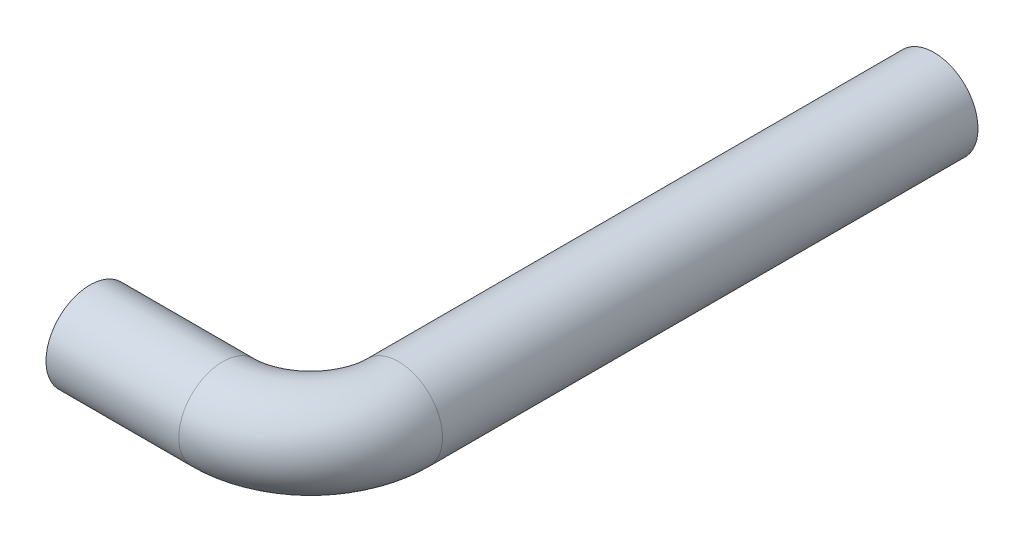
ISO-10303-21;
HEADER;
FILE_DESCRIPTION(('STEP AP214'),'2;1');
FILE_NAME('part.step','',(''),(''),'','','');
FILE_SCHEMA(('AUTOMOTIVE_DESIGN { 1 0 10303 214 1 1 1 1 }'));
ENDSEC;
DATA;
#1=APPLICATION_CONTEXT('core data for automotive mechanical design processes');
#2=APPLICATION_PROTOCOL_DEFINITION('international standard','automotive_design',2000,#1);
#3=PRODUCT_CONTEXT('',#1,'mechanical');
#4=PRODUCT('Part','Part','',(#3));
#5=PRODUCT_RELATED_PRODUCT_CATEGORY('part','',(#4));
#6=PRODUCT_DEFINITION_FORMATION('','',#4);
#7=PRODUCT_DEFINITION_CONTEXT('part definition',#1,'design');
#8=PRODUCT_DEFINITION('design','',#6,#7);
#9=PRODUCT_DEFINITION_SHAPE('','',#8);
#10=(LENGTH_UNIT() NAMED_UNIT(*) SI_UNIT(.MILLI.,.METRE.));
#11=(NAMED_UNIT(*) PLANE_ANGLE_UNIT() SI_UNIT($,.RADIAN.));
#12=(NAMED_UNIT(*) SI_UNIT($,.STERADIAN.) SOLID_ANGLE_UNIT());
#13=UNCERTAINTY_MEASURE_WITH_UNIT(LENGTH_MEASURE(1.E-05),#10,'distance_accuracy_value','');
#14=(GEOMETRIC_REPRESENTATION_CONTEXT(3) GLOBAL_UNCERTAINTY_ASSIGNED_CONTEXT((#13)) GLOBAL_UNIT_ASSIGNED_CONTEXT((#10,
#11,#12)) REPRESENTATION_CONTEXT('',''));
#15=CARTESIAN_POINT('',(0.,0.,0.));
#16=DIRECTION('',(0.,0.,1.));
#17=DIRECTION('',(1.,0.,0.));
#18=AXIS2_PLACEMENT_3D('',#15,#16,#17);
#19=CARTESIAN_POINT('',(8.77931775502365,0.,1.4));
#20=DIRECTION('',(1.,0.,0.));
#21=DIRECTION('',(0.,0.,1.));
#22=AXIS2_PLACEMENT_3D('',#19,#20,#21);
#23=CYLINDRICAL_SURFACE('',#22,0.275);
#24=CARTESIAN_POINT('',(9.61,0.,1.4));
#25=DIRECTION('',(1.,0.,0.));
#26=DIRECTION('',(0.,0.,1.));
#27=AXIS2_PLACEMENT_3D('',#24,#25,#26);
#28=CIRCLE('',#27,0.275);
#29=CARTESIAN_POINT('',(9.61,0.,1.675));
#30=VERTEX_POINT('',#29);
#31=EDGE_CURVE('E11',#30,#30,#28,.T.);
#32=ORIENTED_EDGE('',*,*,#31,.F.);
#33=CARTESIAN_POINT('',(8.77931775502365,0.,1.675));
#34=CARTESIAN_POINT('',(9.61,0.,1.675));
#35=B_SPLINE_CURVE_WITH_KNOTS('',1,(#33,#34),.UNSPECIFIED.,.F.,.F.,(2,2),(0.,0.83068224497635),.UNSPECIFIED.);
#36=CARTESIAN_POINT('',(8.77931775502365,0.,1.675));
#37=VERTEX_POINT('',#36);
#38=EDGE_CURVE('E24',#37,#30,#35,.T.);
#39=ORIENTED_EDGE('',*,*,#38,.F.);
#40=CARTESIAN_POINT('',(8.77931775502365,0.,1.4));
#41=DIRECTION('',(1.,0.,0.));
#42=DIRECTION('',(0.,0.,1.));
#43=AXIS2_PLACEMENT_3D('',#40,#41,#42);
#44=CIRCLE('',#43,0.275);
#45=EDGE_CURVE('E67',#37,#37,#44,.T.);
#46=ORIENTED_EDGE('',*,*,#45,.T.);
#47=ORIENTED_EDGE('',*,*,#38,.T.);
#48=EDGE_LOOP('',(#32,#39,#46,#47));
#49=FACE_BOUND('',#48,.T.);
#50=ADVANCED_FACE('F17',(#49),#23,.T.);
#51=CARTESIAN_POINT('',(9.61,0.,0.85));
#52=DIRECTION('',(0.,1.,0.));
#53=DIRECTION('',(0.,0.,1.));
#54=AXIS2_PLACEMENT_3D('',#51,#52,#53);
#55=TOROIDAL_SURFACE('',#54,0.55,0.275);
#56=CARTESIAN_POINT('',(10.16,0.,0.849999999999999));
#57=DIRECTION('',(0.,0.,-1.));
#58=DIRECTION('',(1.,0.,0.));
#59=AXIS2_PLACEMENT_3D('',#56,#57,#58);
#60=CIRCLE('',#59,0.275);
#61=CARTESIAN_POINT('',(10.435,0.,0.849999999999998));
#62=VERTEX_POINT('',#61);
#63=EDGE_CURVE('E48',#62,#62,#60,.T.);
#64=ORIENTED_EDGE('',*,*,#63,.F.);
#65=CARTESIAN_POINT('',(9.61,0.,1.675));
#66=CARTESIAN_POINT('',(9.82598449493431,0.,1.675));
#67=CARTESIAN_POINT('',(10.0419506130817,0.,1.60716215903328));
#68=CARTESIAN_POINT('',(10.2313818734532,0.,1.47138187345315));
#69=CARTESIAN_POINT('',(10.3671621590332,0.,1.28195061308174));
#70=CARTESIAN_POINT('',(10.435,0.,1.0659844949343));
#71=CARTESIAN_POINT('',(10.435,0.,0.849999999999998));
#72=B_SPLINE_CURVE_WITH_KNOTS('',6,(#65,#66,#67,#68,#69,#70,#71),.UNSPECIFIED.,.F.,.F.,(7,7),
(0.,1.5707963267949),.UNSPECIFIED.);
#73=EDGE_CURVE('E49',#30,#62,#72,.T.);
#74=ORIENTED_EDGE('',*,*,#73,.F.);
#75=ORIENTED_EDGE('',*,*,#31,.T.);
#76=ORIENTED_EDGE('',*,*,#73,.T.);
#77=EDGE_LOOP('',(#64,#74,#75,#76));
#78=FACE_BOUND('',#77,.T.);
#79=ADVANCED_FACE('F74',(#78),#55,.T.);
#80=CARTESIAN_POINT('',(10.16,0.,0.849999999999998));
#81=DIRECTION('',(0.,0.,-1.));
#82=DIRECTION('',(1.,0.,0.));
#83=AXIS2_PLACEMENT_3D('',#80,#81,#82);
#84=CYLINDRICAL_SURFACE('',#83,0.275);
#85=ORIENTED_EDGE('',*,*,#63,.T.);
#86=CARTESIAN_POINT('',(10.435,0.,0.849999999999998));
#87=CARTESIAN_POINT('',(10.435,0.,-2.5));
#88=B_SPLINE_CURVE_WITH_KNOTS('',1,(#86,#87),.UNSPECIFIED.,.F.,.F.,(2,2),(0.,3.35),.UNSPECIFIED.);
#89=CARTESIAN_POINT('',(10.435,0.,-2.5));
#90=VERTEX_POINT('',#89);
#91=EDGE_CURVE('E43',#62,#90,#88,.T.);
#92=ORIENTED_EDGE('',*,*,#91,.T.);
#93=CARTESIAN_POINT('',(10.16,0.,-2.5));
#94=DIRECTION('',(0.,0.,-1.));
#95=DIRECTION('',(1.,0.,0.));
#96=AXIS2_PLACEMENT_3D('',#93,#94,#95);
#97=CIRCLE('',#96,0.275);
#98=EDGE_CURVE('E46',#90,#90,#97,.T.);
#99=ORIENTED_EDGE('',*,*,#98,.F.);
#100=ORIENTED_EDGE('',*,*,#91,.F.);
#101=EDGE_LOOP('',(#85,#92,#99,#100));
#102=FACE_BOUND('',#101,.T.);
#103=ADVANCED_FACE('F45',(#102),#84,.T.);
#104=CARTESIAN_POINT('',(8.76,0.,-2.5));
#105=DIRECTION('',(0.,0.,-1.));
#106=DIRECTION('',(1.,0.,0.));
#107=AXIS2_PLACEMENT_3D('',#104,#105,#106);
#108=PLANE('',#107);
#109=ORIENTED_EDGE('',*,*,#98,.T.);
#110=EDGE_LOOP('',(#109));
#111=FACE_BOUND('',#110,.T.);
#112=ADVANCED_FACE('F52',(#111),#108,.T.);
#113=CARTESIAN_POINT('',(8.77931775502365,0.,0.));
#114=DIRECTION('',(1.,0.,0.));
#115=DIRECTION('',(0.,0.,1.));
#116=AXIS2_PLACEMENT_3D('',#113,#114,#115);
#117=PLANE('',#116);
#118=ORIENTED_EDGE('',*,*,#45,.F.);
#119=EDGE_LOOP('',(#118));
#120=FACE_BOUND('',#119,.T.);
#121=ADVANCED_FACE('F85',(#120),#117,.F.);
#122=CLOSED_SHELL('',(#50,#79,#103,#112,#121));
#123=MANIFOLD_SOLID_BREP('B1',#122);
#124=ADVANCED_BREP_SHAPE_REPRESENTATION('',(#18,#123),#14);
#125=SHAPE_DEFINITION_REPRESENTATION(#9,#124);
ENDSEC;
END-ISO-10303-21;
